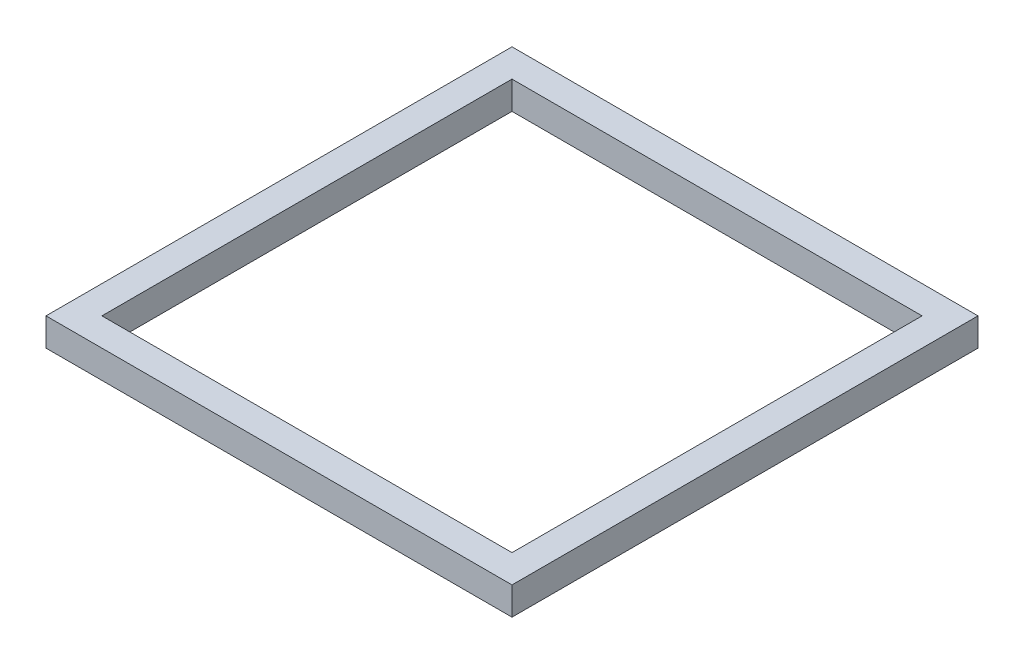
ISO-10303-21;
HEADER;
FILE_DESCRIPTION(('STEP AP214'),'2;1');
FILE_NAME('part.step','',(''),(''),'','','');
FILE_SCHEMA(('AUTOMOTIVE_DESIGN { 1 0 10303 214 1 1 1 1 }'));
ENDSEC;
DATA;
#1=APPLICATION_CONTEXT('core data for automotive mechanical design processes');
#2=APPLICATION_PROTOCOL_DEFINITION('international standard','automotive_design',2000,#1);
#3=PRODUCT_CONTEXT('',#1,'mechanical');
#4=PRODUCT('Part','Part','',(#3));
#5=PRODUCT_RELATED_PRODUCT_CATEGORY('part','',(#4));
#6=PRODUCT_DEFINITION_FORMATION('','',#4);
#7=PRODUCT_DEFINITION_CONTEXT('part definition',#1,'design');
#8=PRODUCT_DEFINITION('design','',#6,#7);
#9=PRODUCT_DEFINITION_SHAPE('','',#8);
#10=(LENGTH_UNIT() NAMED_UNIT(*) SI_UNIT(.MILLI.,.METRE.));
#11=(NAMED_UNIT(*) PLANE_ANGLE_UNIT() SI_UNIT($,.RADIAN.));
#12=(NAMED_UNIT(*) SI_UNIT($,.STERADIAN.) SOLID_ANGLE_UNIT());
#13=UNCERTAINTY_MEASURE_WITH_UNIT(LENGTH_MEASURE(1.E-05),#10,'distance_accuracy_value','');
#14=(GEOMETRIC_REPRESENTATION_CONTEXT(3) GLOBAL_UNCERTAINTY_ASSIGNED_CONTEXT((#13)) GLOBAL_UNIT_ASSIGNED_CONTEXT((#10,
#11,#12)) REPRESENTATION_CONTEXT('',''));
#15=CARTESIAN_POINT('',(0.,0.,0.));
#16=DIRECTION('',(0.,0.,1.));
#17=DIRECTION('',(1.,0.,0.));
#18=AXIS2_PLACEMENT_3D('',#15,#16,#17);
#19=CARTESIAN_POINT('',(0.,30.,0.));
#20=DIRECTION('',(0.,-1.,0.));
#21=DIRECTION('',(0.,0.,-1.));
#22=AXIS2_PLACEMENT_3D('',#19,#20,#21);
#23=PLANE('',#22);
#24=DIRECTION('',(0.,0.,-1.));
#25=VECTOR('',#24,1.);
#26=CARTESIAN_POINT('',(250.,30.,250.));
#27=LINE('',#26,#25);
#28=CARTESIAN_POINT('',(250.,30.,250.));
#29=VERTEX_POINT('',#28);
#30=CARTESIAN_POINT('',(250.,30.,-250.));
#31=VERTEX_POINT('',#30);
#32=EDGE_CURVE('E138',#29,#31,#27,.T.);
#33=ORIENTED_EDGE('',*,*,#32,.T.);
#34=DIRECTION('',(-1.,0.,0.));
#35=VECTOR('',#34,1.);
#36=CARTESIAN_POINT('',(-250.,30.,-250.));
#37=LINE('',#36,#35);
#38=CARTESIAN_POINT('',(-250.,30.,-250.));
#39=VERTEX_POINT('',#38);
#40=EDGE_CURVE('E141',#31,#39,#37,.T.);
#41=ORIENTED_EDGE('',*,*,#40,.T.);
#42=DIRECTION('',(0.,0.,1.));
#43=VECTOR('',#42,1.);
#44=CARTESIAN_POINT('',(-250.,30.,250.));
#45=LINE('',#44,#43);
#46=CARTESIAN_POINT('',(-250.,30.,250.));
#47=VERTEX_POINT('',#46);
#48=EDGE_CURVE('E144',#39,#47,#45,.T.);
#49=ORIENTED_EDGE('',*,*,#48,.T.);
#50=DIRECTION('',(1.,0.,0.));
#51=VECTOR('',#50,1.);
#52=CARTESIAN_POINT('',(-250.,30.,250.));
#53=LINE('',#52,#51);
#54=EDGE_CURVE('E146',#47,#29,#53,.T.);
#55=ORIENTED_EDGE('',*,*,#54,.T.);
#56=EDGE_LOOP('',(#33,#41,#49,#55));
#57=FACE_BOUND('',#56,.T.);
#58=DIRECTION('',(0.,0.,1.));
#59=VECTOR('',#58,1.);
#60=CARTESIAN_POINT('',(-220.,30.,220.));
#61=LINE('',#60,#59);
#62=CARTESIAN_POINT('',(-220.,30.,-220.));
#63=VERTEX_POINT('',#62);
#64=CARTESIAN_POINT('',(-220.,30.,220.));
#65=VERTEX_POINT('',#64);
#66=EDGE_CURVE('E102',#63,#65,#61,.T.);
#67=ORIENTED_EDGE('',*,*,#66,.F.);
#68=DIRECTION('',(-1.,0.,0.));
#69=VECTOR('',#68,1.);
#70=CARTESIAN_POINT('',(-220.,30.,-220.));
#71=LINE('',#70,#69);
#72=CARTESIAN_POINT('',(220.,30.,-220.));
#73=VERTEX_POINT('',#72);
#74=EDGE_CURVE('E124',#73,#63,#71,.T.);
#75=ORIENTED_EDGE('',*,*,#74,.F.);
#76=DIRECTION('',(0.,0.,-1.));
#77=VECTOR('',#76,1.);
#78=CARTESIAN_POINT('',(220.,30.,220.));
#79=LINE('',#78,#77);
#80=CARTESIAN_POINT('',(220.,30.,220.));
#81=VERTEX_POINT('',#80);
#82=EDGE_CURVE('E122',#81,#73,#79,.T.);
#83=ORIENTED_EDGE('',*,*,#82,.F.);
#84=DIRECTION('',(1.,0.,0.));
#85=VECTOR('',#84,1.);
#86=CARTESIAN_POINT('',(-220.,30.,220.));
#87=LINE('',#86,#85);
#88=EDGE_CURVE('E110',#65,#81,#87,.T.);
#89=ORIENTED_EDGE('',*,*,#88,.F.);
#90=EDGE_LOOP('',(#67,#75,#83,#89));
#91=FACE_BOUND('',#90,.T.);
#92=ADVANCED_FACE('F37',(#57,#91),#23,.F.);
#93=CARTESIAN_POINT('',(0.,0.,0.));
#94=DIRECTION('',(0.,-1.,0.));
#95=DIRECTION('',(0.,0.,-1.));
#96=AXIS2_PLACEMENT_3D('',#93,#94,#95);
#97=PLANE('',#96);
#98=DIRECTION('',(0.,0.,-1.));
#99=VECTOR('',#98,1.);
#100=CARTESIAN_POINT('',(250.,0.,250.));
#101=LINE('',#100,#99);
#102=CARTESIAN_POINT('',(250.,0.,250.));
#103=VERTEX_POINT('',#102);
#104=CARTESIAN_POINT('',(250.,0.,-250.));
#105=VERTEX_POINT('',#104);
#106=EDGE_CURVE('E118',#103,#105,#101,.T.);
#107=ORIENTED_EDGE('',*,*,#106,.F.);
#108=DIRECTION('',(1.,0.,0.));
#109=VECTOR('',#108,1.);
#110=CARTESIAN_POINT('',(-250.,0.,250.));
#111=LINE('',#110,#109);
#112=CARTESIAN_POINT('',(-250.,0.,250.));
#113=VERTEX_POINT('',#112);
#114=EDGE_CURVE('E142',#113,#103,#111,.T.);
#115=ORIENTED_EDGE('',*,*,#114,.F.);
#116=DIRECTION('',(0.,0.,1.));
#117=VECTOR('',#116,1.);
#118=CARTESIAN_POINT('',(-250.,0.,250.));
#119=LINE('',#118,#117);
#120=CARTESIAN_POINT('',(-250.,0.,-250.));
#121=VERTEX_POINT('',#120);
#122=EDGE_CURVE('E153',#121,#113,#119,.T.);
#123=ORIENTED_EDGE('',*,*,#122,.F.);
#124=DIRECTION('',(-1.,0.,0.));
#125=VECTOR('',#124,1.);
#126=CARTESIAN_POINT('',(-250.,0.,-250.));
#127=LINE('',#126,#125);
#128=EDGE_CURVE('E151',#105,#121,#127,.T.);
#129=ORIENTED_EDGE('',*,*,#128,.F.);
#130=EDGE_LOOP('',(#107,#115,#123,#129));
#131=FACE_BOUND('',#130,.T.);
#132=DIRECTION('',(-1.,0.,0.));
#133=VECTOR('',#132,1.);
#134=CARTESIAN_POINT('',(-220.,0.,-220.));
#135=LINE('',#134,#133);
#136=CARTESIAN_POINT('',(220.,0.,-220.));
#137=VERTEX_POINT('',#136);
#138=CARTESIAN_POINT('',(-220.,0.,-220.));
#139=VERTEX_POINT('',#138);
#140=EDGE_CURVE('E111',#137,#139,#135,.T.);
#141=ORIENTED_EDGE('',*,*,#140,.T.);
#142=DIRECTION('',(0.,0.,1.));
#143=VECTOR('',#142,1.);
#144=CARTESIAN_POINT('',(-220.,0.,220.));
#145=LINE('',#144,#143);
#146=CARTESIAN_POINT('',(-220.,0.,220.));
#147=VERTEX_POINT('',#146);
#148=EDGE_CURVE('E60',#139,#147,#145,.T.);
#149=ORIENTED_EDGE('',*,*,#148,.T.);
#150=DIRECTION('',(1.,0.,0.));
#151=VECTOR('',#150,1.);
#152=CARTESIAN_POINT('',(-220.,0.,220.));
#153=LINE('',#152,#151);
#154=CARTESIAN_POINT('',(220.,0.,220.));
#155=VERTEX_POINT('',#154);
#156=EDGE_CURVE('E117',#147,#155,#153,.T.);
#157=ORIENTED_EDGE('',*,*,#156,.T.);
#158=DIRECTION('',(0.,0.,-1.));
#159=VECTOR('',#158,1.);
#160=CARTESIAN_POINT('',(220.,0.,220.));
#161=LINE('',#160,#159);
#162=EDGE_CURVE('E130',#155,#137,#161,.T.);
#163=ORIENTED_EDGE('',*,*,#162,.T.);
#164=EDGE_LOOP('',(#141,#149,#157,#163));
#165=FACE_BOUND('',#164,.T.);
#166=ADVANCED_FACE('F171',(#131,#165),#97,.T.);
#167=CARTESIAN_POINT('',(250.,30.,250.));
#168=DIRECTION('',(-1.,0.,0.));
#169=DIRECTION('',(0.,0.,1.));
#170=AXIS2_PLACEMENT_3D('',#167,#168,#169);
#171=PLANE('',#170);
#172=ORIENTED_EDGE('',*,*,#106,.T.);
#173=DIRECTION('',(0.,-1.,0.));
#174=VECTOR('',#173,1.);
#175=CARTESIAN_POINT('',(250.,30.,-250.));
#176=LINE('',#175,#174);
#177=EDGE_CURVE('E11',#31,#105,#176,.T.);
#178=ORIENTED_EDGE('',*,*,#177,.F.);
#179=ORIENTED_EDGE('',*,*,#32,.F.);
#180=DIRECTION('',(0.,-1.,0.));
#181=VECTOR('',#180,1.);
#182=CARTESIAN_POINT('',(250.,30.,250.));
#183=LINE('',#182,#181);
#184=EDGE_CURVE('E148',#29,#103,#183,.T.);
#185=ORIENTED_EDGE('',*,*,#184,.T.);
#186=EDGE_LOOP('',(#172,#178,#179,#185));
#187=FACE_BOUND('',#186,.T.);
#188=ADVANCED_FACE('F39',(#187),#171,.F.);
#189=CARTESIAN_POINT('',(-250.,30.,-250.));
#190=DIRECTION('',(0.,0.,1.));
#191=DIRECTION('',(1.,0.,0.));
#192=AXIS2_PLACEMENT_3D('',#189,#190,#191);
#193=PLANE('',#192);
#194=ORIENTED_EDGE('',*,*,#128,.T.);
#195=DIRECTION('',(0.,-1.,0.));
#196=VECTOR('',#195,1.);
#197=CARTESIAN_POINT('',(-250.,30.,-250.));
#198=LINE('',#197,#196);
#199=EDGE_CURVE('E45',#39,#121,#198,.T.);
#200=ORIENTED_EDGE('',*,*,#199,.F.);
#201=ORIENTED_EDGE('',*,*,#40,.F.);
#202=ORIENTED_EDGE('',*,*,#177,.T.);
#203=EDGE_LOOP('',(#194,#200,#201,#202));
#204=FACE_BOUND('',#203,.T.);
#205=ADVANCED_FACE('F181',(#204),#193,.F.);
#206=CARTESIAN_POINT('',(-250.,30.,250.));
#207=DIRECTION('',(1.,0.,0.));
#208=DIRECTION('',(0.,0.,-1.));
#209=AXIS2_PLACEMENT_3D('',#206,#207,#208);
#210=PLANE('',#209);
#211=ORIENTED_EDGE('',*,*,#122,.T.);
#212=DIRECTION('',(0.,-1.,0.));
#213=VECTOR('',#212,1.);
#214=CARTESIAN_POINT('',(-250.,30.,250.));
#215=LINE('',#214,#213);
#216=EDGE_CURVE('E158',#47,#113,#215,.T.);
#217=ORIENTED_EDGE('',*,*,#216,.F.);
#218=ORIENTED_EDGE('',*,*,#48,.F.);
#219=ORIENTED_EDGE('',*,*,#199,.T.);
#220=EDGE_LOOP('',(#211,#217,#218,#219));
#221=FACE_BOUND('',#220,.T.);
#222=ADVANCED_FACE('F165',(#221),#210,.F.);
#223=CARTESIAN_POINT('',(-250.,30.,250.));
#224=DIRECTION('',(0.,0.,-1.));
#225=DIRECTION('',(-1.,0.,0.));
#226=AXIS2_PLACEMENT_3D('',#223,#224,#225);
#227=PLANE('',#226);
#228=ORIENTED_EDGE('',*,*,#114,.T.);
#229=ORIENTED_EDGE('',*,*,#184,.F.);
#230=ORIENTED_EDGE('',*,*,#54,.F.);
#231=ORIENTED_EDGE('',*,*,#216,.T.);
#232=EDGE_LOOP('',(#228,#229,#230,#231));
#233=FACE_BOUND('',#232,.T.);
#234=ADVANCED_FACE('F175',(#233),#227,.F.);
#235=CARTESIAN_POINT('',(-220.,30.,220.));
#236=DIRECTION('',(1.,0.,0.));
#237=DIRECTION('',(0.,0.,-1.));
#238=AXIS2_PLACEMENT_3D('',#235,#236,#237);
#239=PLANE('',#238);
#240=ORIENTED_EDGE('',*,*,#148,.F.);
#241=DIRECTION('',(0.,-1.,0.));
#242=VECTOR('',#241,1.);
#243=CARTESIAN_POINT('',(-220.,30.,-220.));
#244=LINE('',#243,#242);
#245=EDGE_CURVE('E106',#63,#139,#244,.T.);
#246=ORIENTED_EDGE('',*,*,#245,.F.);
#247=ORIENTED_EDGE('',*,*,#66,.T.);
#248=DIRECTION('',(0.,-1.,0.));
#249=VECTOR('',#248,1.);
#250=CARTESIAN_POINT('',(-220.,30.,220.));
#251=LINE('',#250,#249);
#252=EDGE_CURVE('E105',#65,#147,#251,.T.);
#253=ORIENTED_EDGE('',*,*,#252,.T.);
#254=EDGE_LOOP('',(#240,#246,#247,#253));
#255=FACE_BOUND('',#254,.T.);
#256=ADVANCED_FACE('F104',(#255),#239,.T.);
#257=CARTESIAN_POINT('',(-220.,30.,220.));
#258=DIRECTION('',(0.,0.,-1.));
#259=DIRECTION('',(-1.,0.,0.));
#260=AXIS2_PLACEMENT_3D('',#257,#258,#259);
#261=PLANE('',#260);
#262=ORIENTED_EDGE('',*,*,#156,.F.);
#263=ORIENTED_EDGE('',*,*,#252,.F.);
#264=ORIENTED_EDGE('',*,*,#88,.T.);
#265=DIRECTION('',(0.,-1.,0.));
#266=VECTOR('',#265,1.);
#267=CARTESIAN_POINT('',(220.,30.,220.));
#268=LINE('',#267,#266);
#269=EDGE_CURVE('E119',#81,#155,#268,.T.);
#270=ORIENTED_EDGE('',*,*,#269,.T.);
#271=EDGE_LOOP('',(#262,#263,#264,#270));
#272=FACE_BOUND('',#271,.T.);
#273=ADVANCED_FACE('F114',(#272),#261,.T.);
#274=CARTESIAN_POINT('',(220.,30.,220.));
#275=DIRECTION('',(-1.,0.,0.));
#276=DIRECTION('',(0.,0.,1.));
#277=AXIS2_PLACEMENT_3D('',#274,#275,#276);
#278=PLANE('',#277);
#279=ORIENTED_EDGE('',*,*,#162,.F.);
#280=ORIENTED_EDGE('',*,*,#269,.F.);
#281=ORIENTED_EDGE('',*,*,#82,.T.);
#282=DIRECTION('',(0.,-1.,0.));
#283=VECTOR('',#282,1.);
#284=CARTESIAN_POINT('',(220.,30.,-220.));
#285=LINE('',#284,#283);
#286=EDGE_CURVE('E52',#73,#137,#285,.T.);
#287=ORIENTED_EDGE('',*,*,#286,.T.);
#288=EDGE_LOOP('',(#279,#280,#281,#287));
#289=FACE_BOUND('',#288,.T.);
#290=ADVANCED_FACE('F204',(#289),#278,.T.);
#291=CARTESIAN_POINT('',(-220.,30.,-220.));
#292=DIRECTION('',(0.,0.,1.));
#293=DIRECTION('',(1.,0.,0.));
#294=AXIS2_PLACEMENT_3D('',#291,#292,#293);
#295=PLANE('',#294);
#296=ORIENTED_EDGE('',*,*,#140,.F.);
#297=ORIENTED_EDGE('',*,*,#286,.F.);
#298=ORIENTED_EDGE('',*,*,#74,.T.);
#299=ORIENTED_EDGE('',*,*,#245,.T.);
#300=EDGE_LOOP('',(#296,#297,#298,#299));
#301=FACE_BOUND('',#300,.T.);
#302=ADVANCED_FACE('F208',(#301),#295,.T.);
#303=CLOSED_SHELL('',(#92,#166,#188,#205,#222,#234,#256,#273,#290,#302));
#304=MANIFOLD_SOLID_BREP('B2',#303);
#305=ADVANCED_BREP_SHAPE_REPRESENTATION('',(#18,#304),#14);
#306=SHAPE_DEFINITION_REPRESENTATION(#9,#305);
ENDSEC;
END-ISO-10303-21;
